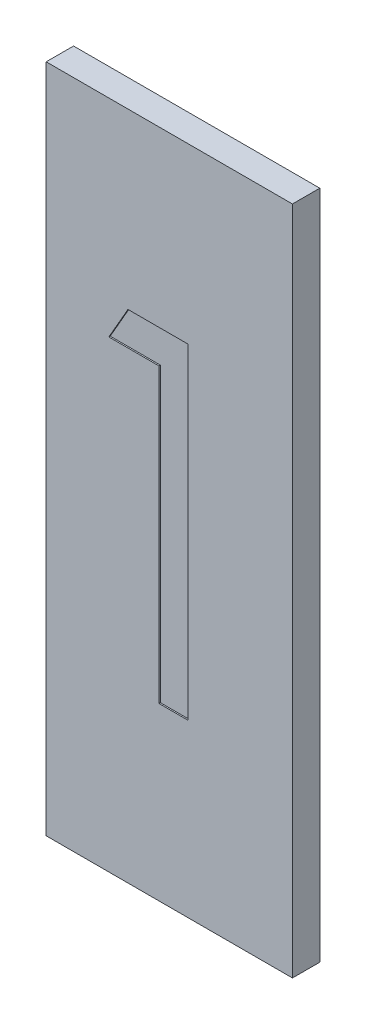
ISO-10303-21;
HEADER;
FILE_DESCRIPTION(('STEP AP214'),'2;1');
FILE_NAME('part.step','',(''),(''),'','','');
FILE_SCHEMA(('AUTOMOTIVE_DESIGN { 1 0 10303 214 1 1 1 1 }'));
ENDSEC;
DATA;
#1=APPLICATION_CONTEXT('core data for automotive mechanical design processes');
#2=APPLICATION_PROTOCOL_DEFINITION('international standard','automotive_design',2000,#1);
#3=PRODUCT_CONTEXT('',#1,'mechanical');
#4=PRODUCT('Part','Part','',(#3));
#5=PRODUCT_RELATED_PRODUCT_CATEGORY('part','',(#4));
#6=PRODUCT_DEFINITION_FORMATION('','',#4);
#7=PRODUCT_DEFINITION_CONTEXT('part definition',#1,'design');
#8=PRODUCT_DEFINITION('design','',#6,#7);
#9=PRODUCT_DEFINITION_SHAPE('','',#8);
#10=(LENGTH_UNIT() NAMED_UNIT(*) SI_UNIT(.MILLI.,.METRE.));
#11=(NAMED_UNIT(*) PLANE_ANGLE_UNIT() SI_UNIT($,.RADIAN.));
#12=(NAMED_UNIT(*) SI_UNIT($,.STERADIAN.) SOLID_ANGLE_UNIT());
#13=UNCERTAINTY_MEASURE_WITH_UNIT(LENGTH_MEASURE(1.E-05),#10,'distance_accuracy_value','');
#14=(GEOMETRIC_REPRESENTATION_CONTEXT(3) GLOBAL_UNCERTAINTY_ASSIGNED_CONTEXT((#13)) GLOBAL_UNIT_ASSIGNED_CONTEXT((#10,
#11,#12)) REPRESENTATION_CONTEXT('',''));
#15=CARTESIAN_POINT('',(0.,0.,0.));
#16=DIRECTION('',(0.,0.,1.));
#17=DIRECTION('',(1.,0.,0.));
#18=AXIS2_PLACEMENT_3D('',#15,#16,#17);
#19=CARTESIAN_POINT('',(0.,0.,2.));
#20=DIRECTION('',(0.,0.,1.));
#21=DIRECTION('',(1.,0.,0.));
#22=AXIS2_PLACEMENT_3D('',#19,#20,#21);
#23=PLANE('',#22);
#24=DIRECTION('',(0.,-1.,0.));
#25=VECTOR('',#24,1.);
#26=CARTESIAN_POINT('',(0.,0.,2.));
#27=LINE('',#26,#25);
#28=CARTESIAN_POINT('',(0.,49.,2.));
#29=VERTEX_POINT('',#28);
#30=CARTESIAN_POINT('',(0.,0.,2.));
#31=VERTEX_POINT('',#30);
#32=EDGE_CURVE('E150',#29,#31,#27,.T.);
#33=ORIENTED_EDGE('',*,*,#32,.T.);
#34=DIRECTION('',(1.,0.,0.));
#35=VECTOR('',#34,1.);
#36=CARTESIAN_POINT('',(18.,0.,2.));
#37=LINE('',#36,#35);
#38=CARTESIAN_POINT('',(18.,0.,2.));
#39=VERTEX_POINT('',#38);
#40=EDGE_CURVE('E85',#31,#39,#37,.T.);
#41=ORIENTED_EDGE('',*,*,#40,.T.);
#42=DIRECTION('',(0.,1.,0.));
#43=VECTOR('',#42,1.);
#44=CARTESIAN_POINT('',(18.,0.,2.));
#45=LINE('',#44,#43);
#46=CARTESIAN_POINT('',(18.,49.,2.));
#47=VERTEX_POINT('',#46);
#48=EDGE_CURVE('E153',#39,#47,#45,.T.);
#49=ORIENTED_EDGE('',*,*,#48,.T.);
#50=DIRECTION('',(-1.,0.,0.));
#51=VECTOR('',#50,1.);
#52=CARTESIAN_POINT('',(18.,49.,2.));
#53=LINE('',#52,#51);
#54=EDGE_CURVE('E57',#47,#29,#53,.T.);
#55=ORIENTED_EDGE('',*,*,#54,.T.);
#56=EDGE_LOOP('',(#33,#41,#49,#55));
#57=FACE_BOUND('',#56,.T.);
#58=DIRECTION('',(-1.,0.,0.));
#59=VECTOR('',#58,1.);
#60=CARTESIAN_POINT('',(8.24278846153846,33.8701923076923,2.));
#61=LINE('',#60,#59);
#62=CARTESIAN_POINT('',(8.24278846153846,33.8701923076923,2.));
#63=VERTEX_POINT('',#62);
#64=CARTESIAN_POINT('',(4.57932692307692,33.8701923076923,2.));
#65=VERTEX_POINT('',#64);
#66=EDGE_CURVE('E135',#63,#65,#61,.T.);
#67=ORIENTED_EDGE('',*,*,#66,.T.);
#68=DIRECTION('',(0.496686511837686,0.867930013859708,0.));
#69=VECTOR('',#68,1.);
#70=CARTESIAN_POINT('',(4.57932692307692,33.8701923076923,2.));
#71=LINE('',#70,#69);
#72=CARTESIAN_POINT('',(5.97697566105769,36.3125,2.));
#73=VERTEX_POINT('',#72);
#74=EDGE_CURVE('E48',#65,#73,#71,.T.);
#75=ORIENTED_EDGE('',*,*,#74,.T.);
#76=DIRECTION('',(1.,0.,0.));
#77=VECTOR('',#76,1.);
#78=CARTESIAN_POINT('',(5.97697566105769,36.3125,2.));
#79=LINE('',#78,#77);
#80=CARTESIAN_POINT('',(10.3798076923077,36.3125,2.));
#81=VERTEX_POINT('',#80);
#82=EDGE_CURVE('E139',#73,#81,#79,.T.);
#83=ORIENTED_EDGE('',*,*,#82,.T.);
#84=DIRECTION('',(0.,-1.,0.));
#85=VECTOR('',#84,1.);
#86=CARTESIAN_POINT('',(10.3798076923077,36.3125,2.));
#87=LINE('',#86,#85);
#88=CARTESIAN_POINT('',(10.3798076923077,12.5,2.));
#89=VERTEX_POINT('',#88);
#90=EDGE_CURVE('E305',#81,#89,#87,.T.);
#91=ORIENTED_EDGE('',*,*,#90,.T.);
#92=DIRECTION('',(-1.,0.,0.));
#93=VECTOR('',#92,1.);
#94=CARTESIAN_POINT('',(10.3798076923077,12.5,2.));
#95=LINE('',#94,#93);
#96=CARTESIAN_POINT('',(8.24278846153846,12.5,2.));
#97=VERTEX_POINT('',#96);
#98=EDGE_CURVE('E302',#89,#97,#95,.T.);
#99=ORIENTED_EDGE('',*,*,#98,.T.);
#100=DIRECTION('',(0.,1.,0.));
#101=VECTOR('',#100,1.);
#102=CARTESIAN_POINT('',(8.24278846153846,12.5,2.));
#103=LINE('',#102,#101);
#104=EDGE_CURVE('E296',#97,#63,#103,.T.);
#105=ORIENTED_EDGE('',*,*,#104,.T.);
#106=EDGE_LOOP('',(#67,#75,#83,#91,#99,#105));
#107=FACE_BOUND('',#106,.T.);
#108=ADVANCED_FACE('F33',(#57,#107),#23,.T.);
#109=CARTESIAN_POINT('',(0.,0.,2.));
#110=DIRECTION('',(1.,0.,0.));
#111=DIRECTION('',(0.,0.,-1.));
#112=AXIS2_PLACEMENT_3D('',#109,#110,#111);
#113=PLANE('',#112);
#114=DIRECTION('',(0.,-1.,0.));
#115=VECTOR('',#114,1.);
#116=CARTESIAN_POINT('',(0.,0.,0.));
#117=LINE('',#116,#115);
#118=CARTESIAN_POINT('',(0.,49.,0.));
#119=VERTEX_POINT('',#118);
#120=CARTESIAN_POINT('',(0.,0.,0.));
#121=VERTEX_POINT('',#120);
#122=EDGE_CURVE('E140',#119,#121,#117,.T.);
#123=ORIENTED_EDGE('',*,*,#122,.T.);
#124=DIRECTION('',(0.,0.,-1.));
#125=VECTOR('',#124,1.);
#126=CARTESIAN_POINT('',(0.,0.,2.));
#127=LINE('',#126,#125);
#128=EDGE_CURVE('E11',#31,#121,#127,.T.);
#129=ORIENTED_EDGE('',*,*,#128,.F.);
#130=ORIENTED_EDGE('',*,*,#32,.F.);
#131=DIRECTION('',(0.,0.,-1.));
#132=VECTOR('',#131,1.);
#133=CARTESIAN_POINT('',(0.,49.,2.));
#134=LINE('',#133,#132);
#135=EDGE_CURVE('E155',#29,#119,#134,.T.);
#136=ORIENTED_EDGE('',*,*,#135,.T.);
#137=EDGE_LOOP('',(#123,#129,#130,#136));
#138=FACE_BOUND('',#137,.T.);
#139=ADVANCED_FACE('F35',(#138),#113,.F.);
#140=CARTESIAN_POINT('',(18.,0.,2.));
#141=DIRECTION('',(0.,1.,0.));
#142=DIRECTION('',(0.,0.,1.));
#143=AXIS2_PLACEMENT_3D('',#140,#141,#142);
#144=PLANE('',#143);
#145=DIRECTION('',(1.,0.,0.));
#146=VECTOR('',#145,1.);
#147=CARTESIAN_POINT('',(18.,0.,0.));
#148=LINE('',#147,#146);
#149=CARTESIAN_POINT('',(18.,0.,0.));
#150=VERTEX_POINT('',#149);
#151=EDGE_CURVE('E144',#121,#150,#148,.T.);
#152=ORIENTED_EDGE('',*,*,#151,.T.);
#153=DIRECTION('',(0.,0.,-1.));
#154=VECTOR('',#153,1.);
#155=CARTESIAN_POINT('',(18.,0.,2.));
#156=LINE('',#155,#154);
#157=EDGE_CURVE('E41',#39,#150,#156,.T.);
#158=ORIENTED_EDGE('',*,*,#157,.F.);
#159=ORIENTED_EDGE('',*,*,#40,.F.);
#160=ORIENTED_EDGE('',*,*,#128,.T.);
#161=EDGE_LOOP('',(#152,#158,#159,#160));
#162=FACE_BOUND('',#161,.T.);
#163=ADVANCED_FACE('F183',(#162),#144,.F.);
#164=CARTESIAN_POINT('',(18.,0.,2.));
#165=DIRECTION('',(-1.,0.,0.));
#166=DIRECTION('',(0.,0.,1.));
#167=AXIS2_PLACEMENT_3D('',#164,#165,#166);
#168=PLANE('',#167);
#169=DIRECTION('',(0.,1.,0.));
#170=VECTOR('',#169,1.);
#171=CARTESIAN_POINT('',(18.,0.,0.));
#172=LINE('',#171,#170);
#173=CARTESIAN_POINT('',(18.,49.,0.));
#174=VERTEX_POINT('',#173);
#175=EDGE_CURVE('E158',#150,#174,#172,.T.);
#176=ORIENTED_EDGE('',*,*,#175,.T.);
#177=DIRECTION('',(0.,0.,-1.));
#178=VECTOR('',#177,1.);
#179=CARTESIAN_POINT('',(18.,49.,2.));
#180=LINE('',#179,#178);
#181=EDGE_CURVE('E162',#47,#174,#180,.T.);
#182=ORIENTED_EDGE('',*,*,#181,.F.);
#183=ORIENTED_EDGE('',*,*,#48,.F.);
#184=ORIENTED_EDGE('',*,*,#157,.T.);
#185=EDGE_LOOP('',(#176,#182,#183,#184));
#186=FACE_BOUND('',#185,.T.);
#187=ADVANCED_FACE('F167',(#186),#168,.F.);
#188=CARTESIAN_POINT('',(18.,49.,2.));
#189=DIRECTION('',(0.,-1.,0.));
#190=DIRECTION('',(0.,0.,-1.));
#191=AXIS2_PLACEMENT_3D('',#188,#189,#190);
#192=PLANE('',#191);
#193=DIRECTION('',(-1.,0.,0.));
#194=VECTOR('',#193,1.);
#195=CARTESIAN_POINT('',(18.,49.,0.));
#196=LINE('',#195,#194);
#197=EDGE_CURVE('E78',#174,#119,#196,.T.);
#198=ORIENTED_EDGE('',*,*,#197,.T.);
#199=ORIENTED_EDGE('',*,*,#135,.F.);
#200=ORIENTED_EDGE('',*,*,#54,.F.);
#201=ORIENTED_EDGE('',*,*,#181,.T.);
#202=EDGE_LOOP('',(#198,#199,#200,#201));
#203=FACE_BOUND('',#202,.T.);
#204=ADVANCED_FACE('F175',(#203),#192,.F.);
#205=CARTESIAN_POINT('',(0.,0.,0.));
#206=DIRECTION('',(0.,0.,1.));
#207=DIRECTION('',(1.,0.,0.));
#208=AXIS2_PLACEMENT_3D('',#205,#206,#207);
#209=PLANE('',#208);
#210=ORIENTED_EDGE('',*,*,#122,.F.);
#211=ORIENTED_EDGE('',*,*,#197,.F.);
#212=ORIENTED_EDGE('',*,*,#175,.F.);
#213=ORIENTED_EDGE('',*,*,#151,.F.);
#214=EDGE_LOOP('',(#210,#211,#212,#213));
#215=FACE_BOUND('',#214,.T.);
#216=ADVANCED_FACE('F171',(#215),#209,.F.);
#217=CARTESIAN_POINT('',(4.57932692307692,33.8701923076923,1.9));
#218=DIRECTION('',(0.867930013859708,-0.496686511837685,0.));
#219=DIRECTION('',(0.496686511837686,0.867930013859708,0.));
#220=AXIS2_PLACEMENT_3D('',#217,#218,#219);
#221=PLANE('',#220);
#222=ORIENTED_EDGE('',*,*,#74,.F.);
#223=DIRECTION('',(0.,0.,1.));
#224=VECTOR('',#223,1.);
#225=CARTESIAN_POINT('',(4.57932692307692,33.8701923076923,1.9));
#226=LINE('',#225,#224);
#227=CARTESIAN_POINT('',(4.57932692307692,33.8701923076923,1.9));
#228=VERTEX_POINT('',#227);
#229=EDGE_CURVE('E134',#228,#65,#226,.T.);
#230=ORIENTED_EDGE('',*,*,#229,.F.);
#231=DIRECTION('',(0.496686511837686,0.867930013859708,0.));
#232=VECTOR('',#231,1.);
#233=CARTESIAN_POINT('',(4.57932692307692,33.8701923076923,1.9));
#234=LINE('',#233,#232);
#235=CARTESIAN_POINT('',(5.97697566105769,36.3125,1.9));
#236=VERTEX_POINT('',#235);
#237=EDGE_CURVE('E125',#228,#236,#234,.T.);
#238=ORIENTED_EDGE('',*,*,#237,.T.);
#239=DIRECTION('',(0.,0.,1.));
#240=VECTOR('',#239,1.);
#241=CARTESIAN_POINT('',(5.97697566105769,36.3125,1.9));
#242=LINE('',#241,#240);
#243=EDGE_CURVE('E133',#236,#73,#242,.T.);
#244=ORIENTED_EDGE('',*,*,#243,.T.);
#245=EDGE_LOOP('',(#222,#230,#238,#244));
#246=FACE_BOUND('',#245,.T.);
#247=ADVANCED_FACE('F132',(#246),#221,.T.);
#248=CARTESIAN_POINT('',(5.97697566105769,36.3125,1.9));
#249=DIRECTION('',(0.,-1.,0.));
#250=DIRECTION('',(0.,0.,-1.));
#251=AXIS2_PLACEMENT_3D('',#248,#249,#250);
#252=PLANE('',#251);
#253=ORIENTED_EDGE('',*,*,#82,.F.);
#254=ORIENTED_EDGE('',*,*,#243,.F.);
#255=DIRECTION('',(1.,0.,0.));
#256=VECTOR('',#255,1.);
#257=CARTESIAN_POINT('',(5.97697566105769,36.3125,1.9));
#258=LINE('',#257,#256);
#259=CARTESIAN_POINT('',(10.3798076923077,36.3125,1.9));
#260=VERTEX_POINT('',#259);
#261=EDGE_CURVE('E121',#236,#260,#258,.T.);
#262=ORIENTED_EDGE('',*,*,#261,.T.);
#263=DIRECTION('',(0.,0.,1.));
#264=VECTOR('',#263,1.);
#265=CARTESIAN_POINT('',(10.3798076923077,36.3125,1.9));
#266=LINE('',#265,#264);
#267=EDGE_CURVE('E141',#260,#81,#266,.T.);
#268=ORIENTED_EDGE('',*,*,#267,.T.);
#269=EDGE_LOOP('',(#253,#254,#262,#268));
#270=FACE_BOUND('',#269,.T.);
#271=ADVANCED_FACE('F137',(#270),#252,.T.);
#272=CARTESIAN_POINT('',(10.3798076923077,36.3125,1.9));
#273=DIRECTION('',(-1.,0.,0.));
#274=DIRECTION('',(0.,0.,1.));
#275=AXIS2_PLACEMENT_3D('',#272,#273,#274);
#276=PLANE('',#275);
#277=ORIENTED_EDGE('',*,*,#90,.F.);
#278=ORIENTED_EDGE('',*,*,#267,.F.);
#279=DIRECTION('',(0.,-1.,0.));
#280=VECTOR('',#279,1.);
#281=CARTESIAN_POINT('',(10.3798076923077,36.3125,1.9));
#282=LINE('',#281,#280);
#283=CARTESIAN_POINT('',(10.3798076923077,12.5,1.9));
#284=VERTEX_POINT('',#283);
#285=EDGE_CURVE('E127',#260,#284,#282,.T.);
#286=ORIENTED_EDGE('',*,*,#285,.T.);
#287=DIRECTION('',(0.,0.,1.));
#288=VECTOR('',#287,1.);
#289=CARTESIAN_POINT('',(10.3798076923077,12.5,1.9));
#290=LINE('',#289,#288);
#291=EDGE_CURVE('E146',#284,#89,#290,.T.);
#292=ORIENTED_EDGE('',*,*,#291,.T.);
#293=EDGE_LOOP('',(#277,#278,#286,#292));
#294=FACE_BOUND('',#293,.T.);
#295=ADVANCED_FACE('F196',(#294),#276,.T.);
#296=CARTESIAN_POINT('',(10.3798076923077,12.5,1.9));
#297=DIRECTION('',(0.,1.,0.));
#298=DIRECTION('',(0.,0.,1.));
#299=AXIS2_PLACEMENT_3D('',#296,#297,#298);
#300=PLANE('',#299);
#301=ORIENTED_EDGE('',*,*,#98,.F.);
#302=ORIENTED_EDGE('',*,*,#291,.F.);
#303=DIRECTION('',(-1.,0.,0.));
#304=VECTOR('',#303,1.);
#305=CARTESIAN_POINT('',(10.3798076923077,12.5,1.9));
#306=LINE('',#305,#304);
#307=CARTESIAN_POINT('',(8.24278846153846,12.5,1.9));
#308=VERTEX_POINT('',#307);
#309=EDGE_CURVE('E321',#284,#308,#306,.T.);
#310=ORIENTED_EDGE('',*,*,#309,.T.);
#311=DIRECTION('',(0.,0.,1.));
#312=VECTOR('',#311,1.);
#313=CARTESIAN_POINT('',(8.24278846153846,12.5,1.9));
#314=LINE('',#313,#312);
#315=EDGE_CURVE('E312',#308,#97,#314,.T.);
#316=ORIENTED_EDGE('',*,*,#315,.T.);
#317=EDGE_LOOP('',(#301,#302,#310,#316));
#318=FACE_BOUND('',#317,.T.);
#319=ADVANCED_FACE('F199',(#318),#300,.T.);
#320=CARTESIAN_POINT('',(8.24278846153846,12.5,1.9));
#321=DIRECTION('',(1.,0.,0.));
#322=DIRECTION('',(0.,0.,-1.));
#323=AXIS2_PLACEMENT_3D('',#320,#321,#322);
#324=PLANE('',#323);
#325=ORIENTED_EDGE('',*,*,#104,.F.);
#326=ORIENTED_EDGE('',*,*,#315,.F.);
#327=DIRECTION('',(0.,1.,0.));
#328=VECTOR('',#327,1.);
#329=CARTESIAN_POINT('',(8.24278846153846,12.5,1.9));
#330=LINE('',#329,#328);
#331=CARTESIAN_POINT('',(8.24278846153846,33.8701923076923,1.9));
#332=VERTEX_POINT('',#331);
#333=EDGE_CURVE('E319',#308,#332,#330,.T.);
#334=ORIENTED_EDGE('',*,*,#333,.T.);
#335=DIRECTION('',(0.,0.,1.));
#336=VECTOR('',#335,1.);
#337=CARTESIAN_POINT('',(8.24278846153846,33.8701923076923,1.9));
#338=LINE('',#337,#336);
#339=EDGE_CURVE('E295',#332,#63,#338,.T.);
#340=ORIENTED_EDGE('',*,*,#339,.T.);
#341=EDGE_LOOP('',(#325,#326,#334,#340));
#342=FACE_BOUND('',#341,.T.);
#343=ADVANCED_FACE('F203',(#342),#324,.T.);
#344=CARTESIAN_POINT('',(8.24278846153846,33.8701923076923,1.9));
#345=DIRECTION('',(0.,1.,0.));
#346=DIRECTION('',(0.,0.,1.));
#347=AXIS2_PLACEMENT_3D('',#344,#345,#346);
#348=PLANE('',#347);
#349=ORIENTED_EDGE('',*,*,#66,.F.);
#350=ORIENTED_EDGE('',*,*,#339,.F.);
#351=DIRECTION('',(-1.,0.,0.));
#352=VECTOR('',#351,1.);
#353=CARTESIAN_POINT('',(8.24278846153846,33.8701923076923,1.9));
#354=LINE('',#353,#352);
#355=EDGE_CURVE('E310',#332,#228,#354,.T.);
#356=ORIENTED_EDGE('',*,*,#355,.T.);
#357=ORIENTED_EDGE('',*,*,#229,.T.);
#358=EDGE_LOOP('',(#349,#350,#356,#357));
#359=FACE_BOUND('',#358,.T.);
#360=ADVANCED_FACE('F207',(#359),#348,.T.);
#361=CARTESIAN_POINT('',(0.,0.,1.9));
#362=DIRECTION('',(0.,0.,-1.));
#363=DIRECTION('',(-1.,0.,0.));
#364=AXIS2_PLACEMENT_3D('',#361,#362,#363);
#365=PLANE('',#364);
#366=ORIENTED_EDGE('',*,*,#237,.F.);
#367=ORIENTED_EDGE('',*,*,#355,.F.);
#368=ORIENTED_EDGE('',*,*,#333,.F.);
#369=ORIENTED_EDGE('',*,*,#309,.F.);
#370=ORIENTED_EDGE('',*,*,#285,.F.);
#371=ORIENTED_EDGE('',*,*,#261,.F.);
#372=EDGE_LOOP('',(#366,#367,#368,#369,#370,#371));
#373=FACE_BOUND('',#372,.T.);
#374=ADVANCED_FACE('F123',(#373),#365,.F.);
#375=CLOSED_SHELL('',(#108,#139,#163,#187,#204,#216,#247,#271,#295,#319,#343,#360,#374));
#376=MANIFOLD_SOLID_BREP('B2',#375);
#377=ADVANCED_BREP_SHAPE_REPRESENTATION('',(#18,#376),#14);
#378=SHAPE_DEFINITION_REPRESENTATION(#9,#377);
ENDSEC;
END-ISO-10303-21;
